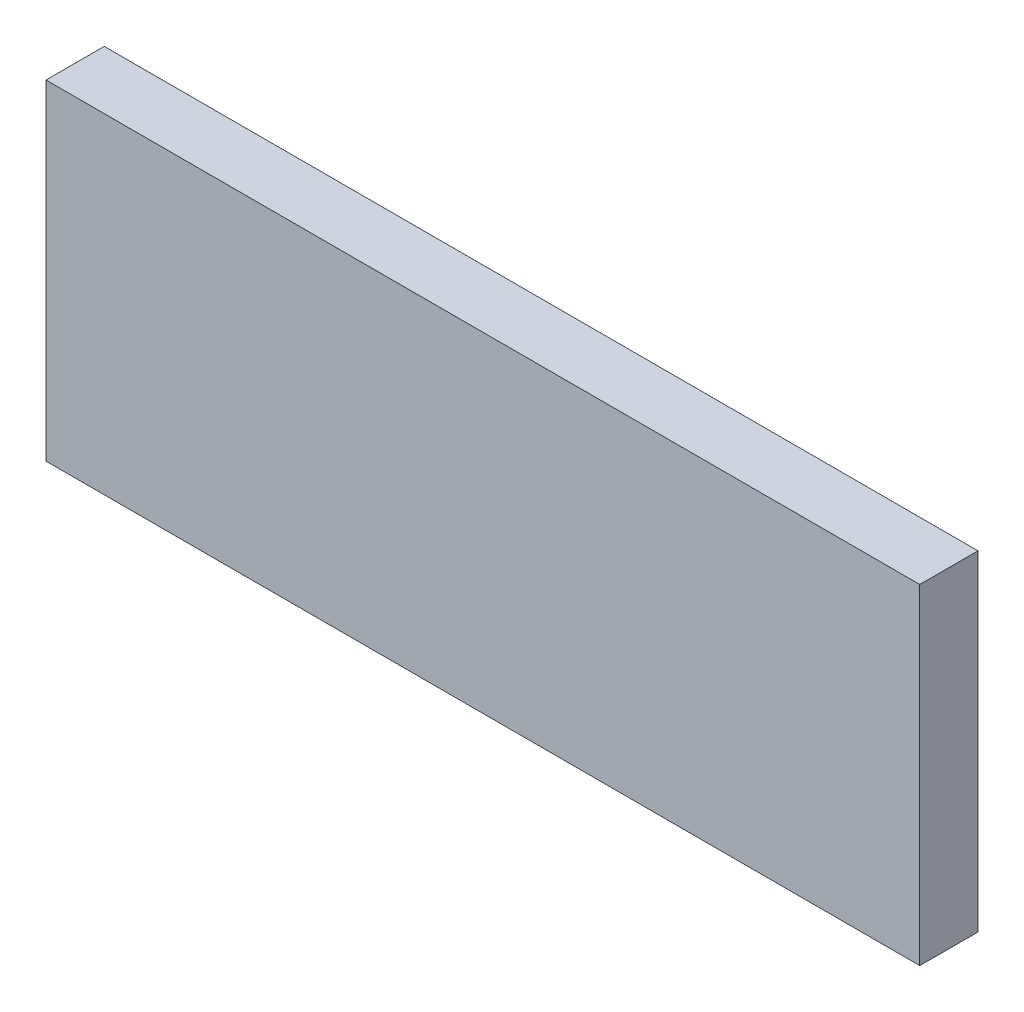
ISO-10303-21;
HEADER;
FILE_DESCRIPTION(('STEP AP214'),'2;1');
FILE_NAME('part.step','',(''),(''),'','','');
FILE_SCHEMA(('AUTOMOTIVE_DESIGN { 1 0 10303 214 1 1 1 1 }'));
ENDSEC;
DATA;
#1=APPLICATION_CONTEXT('core data for automotive mechanical design processes');
#2=APPLICATION_PROTOCOL_DEFINITION('international standard','automotive_design',2000,#1);
#3=PRODUCT_CONTEXT('',#1,'mechanical');
#4=PRODUCT('Part','Part','',(#3));
#5=PRODUCT_RELATED_PRODUCT_CATEGORY('part','',(#4));
#6=PRODUCT_DEFINITION_FORMATION('','',#4);
#7=PRODUCT_DEFINITION_CONTEXT('part definition',#1,'design');
#8=PRODUCT_DEFINITION('design','',#6,#7);
#9=PRODUCT_DEFINITION_SHAPE('','',#8);
#10=(LENGTH_UNIT() NAMED_UNIT(*) SI_UNIT(.MILLI.,.METRE.));
#11=(NAMED_UNIT(*) PLANE_ANGLE_UNIT() SI_UNIT($,.RADIAN.));
#12=(NAMED_UNIT(*) SI_UNIT($,.STERADIAN.) SOLID_ANGLE_UNIT());
#13=UNCERTAINTY_MEASURE_WITH_UNIT(LENGTH_MEASURE(1.E-05),#10,'distance_accuracy_value','');
#14=(GEOMETRIC_REPRESENTATION_CONTEXT(3) GLOBAL_UNCERTAINTY_ASSIGNED_CONTEXT((#13)) GLOBAL_UNIT_ASSIGNED_CONTEXT((#10,
#11,#12)) REPRESENTATION_CONTEXT('',''));
#15=CARTESIAN_POINT('',(0.,0.,0.));
#16=DIRECTION('',(0.,0.,1.));
#17=DIRECTION('',(1.,0.,0.));
#18=AXIS2_PLACEMENT_3D('',#15,#16,#17);
#19=CARTESIAN_POINT('',(0.,0.,300.));
#20=DIRECTION('',(1.,0.,0.));
#21=DIRECTION('',(0.,0.,-1.));
#22=AXIS2_PLACEMENT_3D('',#19,#20,#21);
#23=PLANE('',#22);
#24=DIRECTION('',(0.,-1.,0.));
#25=VECTOR('',#24,1.);
#26=CARTESIAN_POINT('',(0.,0.,0.));
#27=LINE('',#26,#25);
#28=CARTESIAN_POINT('',(0.,1700.,0.));
#29=VERTEX_POINT('',#28);
#30=CARTESIAN_POINT('',(0.,0.,0.));
#31=VERTEX_POINT('',#30);
#32=EDGE_CURVE('E155',#29,#31,#27,.T.);
#33=ORIENTED_EDGE('',*,*,#32,.T.);
#34=DIRECTION('',(0.,0.,-1.));
#35=VECTOR('',#34,1.);
#36=CARTESIAN_POINT('',(0.,0.,300.));
#37=LINE('',#36,#35);
#38=CARTESIAN_POINT('',(0.,0.,300.));
#39=VERTEX_POINT('',#38);
#40=EDGE_CURVE('E144',#39,#31,#37,.T.);
#41=ORIENTED_EDGE('',*,*,#40,.F.);
#42=DIRECTION('',(0.,-1.,0.));
#43=VECTOR('',#42,1.);
#44=CARTESIAN_POINT('',(0.,0.,300.));
#45=LINE('',#44,#43);
#46=CARTESIAN_POINT('',(0.,1700.,300.));
#47=VERTEX_POINT('',#46);
#48=EDGE_CURVE('E136',#47,#39,#45,.T.);
#49=ORIENTED_EDGE('',*,*,#48,.F.);
#50=DIRECTION('',(0.,0.,-1.));
#51=VECTOR('',#50,1.);
#52=CARTESIAN_POINT('',(0.,1700.,300.));
#53=LINE('',#52,#51);
#54=EDGE_CURVE('E151',#47,#29,#53,.T.);
#55=ORIENTED_EDGE('',*,*,#54,.T.);
#56=EDGE_LOOP('',(#33,#41,#49,#55));
#57=FACE_BOUND('',#56,.T.);
#58=ADVANCED_FACE('F42',(#57),#23,.F.);
#59=CARTESIAN_POINT('',(0.,0.,300.));
#60=DIRECTION('',(0.,1.,0.));
#61=DIRECTION('',(0.,0.,1.));
#62=AXIS2_PLACEMENT_3D('',#59,#60,#61);
#63=PLANE('',#62);
#64=DIRECTION('',(1.,0.,0.));
#65=VECTOR('',#64,1.);
#66=CARTESIAN_POINT('',(0.,0.,0.));
#67=LINE('',#66,#65);
#68=CARTESIAN_POINT('',(4500.,0.,0.));
#69=VERTEX_POINT('',#68);
#70=EDGE_CURVE('E142',#31,#69,#67,.T.);
#71=ORIENTED_EDGE('',*,*,#70,.T.);
#72=DIRECTION('',(0.,0.,-1.));
#73=VECTOR('',#72,1.);
#74=CARTESIAN_POINT('',(4500.,0.,300.));
#75=LINE('',#74,#73);
#76=CARTESIAN_POINT('',(4500.,0.,300.));
#77=VERTEX_POINT('',#76);
#78=EDGE_CURVE('E140',#77,#69,#75,.T.);
#79=ORIENTED_EDGE('',*,*,#78,.F.);
#80=DIRECTION('',(1.,0.,0.));
#81=VECTOR('',#80,1.);
#82=CARTESIAN_POINT('',(0.,0.,300.));
#83=LINE('',#82,#81);
#84=EDGE_CURVE('E131',#39,#77,#83,.T.);
#85=ORIENTED_EDGE('',*,*,#84,.F.);
#86=ORIENTED_EDGE('',*,*,#40,.T.);
#87=EDGE_LOOP('',(#71,#79,#85,#86));
#88=FACE_BOUND('',#87,.T.);
#89=ADVANCED_FACE('F141',(#88),#63,.F.);
#90=CARTESIAN_POINT('',(4500.,0.,300.));
#91=DIRECTION('',(-1.,0.,0.));
#92=DIRECTION('',(0.,0.,1.));
#93=AXIS2_PLACEMENT_3D('',#90,#91,#92);
#94=PLANE('',#93);
#95=DIRECTION('',(0.,1.,0.));
#96=VECTOR('',#95,1.);
#97=CARTESIAN_POINT('',(4500.,0.,0.));
#98=LINE('',#97,#96);
#99=CARTESIAN_POINT('',(4500.,1700.,0.));
#100=VERTEX_POINT('',#99);
#101=EDGE_CURVE('E115',#69,#100,#98,.T.);
#102=ORIENTED_EDGE('',*,*,#101,.T.);
#103=DIRECTION('',(0.,0.,-1.));
#104=VECTOR('',#103,1.);
#105=CARTESIAN_POINT('',(4500.,1700.,300.));
#106=LINE('',#105,#104);
#107=CARTESIAN_POINT('',(4500.,1700.,300.));
#108=VERTEX_POINT('',#107);
#109=EDGE_CURVE('E145',#108,#100,#106,.T.);
#110=ORIENTED_EDGE('',*,*,#109,.F.);
#111=DIRECTION('',(0.,1.,0.));
#112=VECTOR('',#111,1.);
#113=CARTESIAN_POINT('',(4500.,0.,300.));
#114=LINE('',#113,#112);
#115=EDGE_CURVE('E134',#77,#108,#114,.T.);
#116=ORIENTED_EDGE('',*,*,#115,.F.);
#117=ORIENTED_EDGE('',*,*,#78,.T.);
#118=EDGE_LOOP('',(#102,#110,#116,#117));
#119=FACE_BOUND('',#118,.T.);
#120=ADVANCED_FACE('F147',(#119),#94,.F.);
#121=CARTESIAN_POINT('',(0.,1700.,300.));
#122=DIRECTION('',(0.,-1.,0.));
#123=DIRECTION('',(0.,0.,-1.));
#124=AXIS2_PLACEMENT_3D('',#121,#122,#123);
#125=PLANE('',#124);
#126=DIRECTION('',(-1.,0.,0.));
#127=VECTOR('',#126,1.);
#128=CARTESIAN_POINT('',(0.,1700.,0.));
#129=LINE('',#128,#127);
#130=EDGE_CURVE('E121',#100,#29,#129,.T.);
#131=ORIENTED_EDGE('',*,*,#130,.T.);
#132=ORIENTED_EDGE('',*,*,#54,.F.);
#133=DIRECTION('',(-1.,0.,0.));
#134=VECTOR('',#133,1.);
#135=CARTESIAN_POINT('',(0.,1700.,300.));
#136=LINE('',#135,#134);
#137=EDGE_CURVE('E98',#108,#47,#136,.T.);
#138=ORIENTED_EDGE('',*,*,#137,.F.);
#139=ORIENTED_EDGE('',*,*,#109,.T.);
#140=EDGE_LOOP('',(#131,#132,#138,#139));
#141=FACE_BOUND('',#140,.T.);
#142=ADVANCED_FACE('F237',(#141),#125,.F.);
#143=CARTESIAN_POINT('',(0.,0.,300.));
#144=DIRECTION('',(0.,0.,-1.));
#145=DIRECTION('',(-1.,0.,0.));
#146=AXIS2_PLACEMENT_3D('',#143,#144,#145);
#147=PLANE('',#146);
#148=ORIENTED_EDGE('',*,*,#48,.T.);
#149=ORIENTED_EDGE('',*,*,#84,.T.);
#150=ORIENTED_EDGE('',*,*,#115,.T.);
#151=ORIENTED_EDGE('',*,*,#137,.T.);
#152=EDGE_LOOP('',(#148,#149,#150,#151));
#153=FACE_BOUND('',#152,.T.);
#154=ADVANCED_FACE('F132',(#153),#147,.F.);
#155=CARTESIAN_POINT('',(0.,0.,0.));
#156=DIRECTION('',(0.,0.,-1.));
#157=DIRECTION('',(-1.,0.,0.));
#158=AXIS2_PLACEMENT_3D('',#155,#156,#157);
#159=PLANE('',#158);
#160=ORIENTED_EDGE('',*,*,#32,.F.);
#161=ORIENTED_EDGE('',*,*,#130,.F.);
#162=ORIENTED_EDGE('',*,*,#101,.F.);
#163=ORIENTED_EDGE('',*,*,#70,.F.);
#164=EDGE_LOOP('',(#160,#161,#162,#163));
#165=FACE_BOUND('',#164,.T.);
#166=ADVANCED_FACE('F240',(#165),#159,.T.);
#167=CLOSED_SHELL('',(#58,#89,#120,#142,#154,#166));
#168=CARTESIAN_POINT('',(10.,0.,300.));
#169=DIRECTION('',(1.,0.,0.));
#170=DIRECTION('',(0.,0.,-1.));
#171=AXIS2_PLACEMENT_3D('',#168,#169,#170);
#172=PLANE('',#171);
#173=DIRECTION('',(0.,-1.,0.));
#174=VECTOR('',#173,1.);
#175=CARTESIAN_POINT('',(10.,0.,10.));
#176=LINE('',#175,#174);
#177=CARTESIAN_POINT('',(10.,1690.,10.));
#178=VERTEX_POINT('',#177);
#179=CARTESIAN_POINT('',(10.,10.,10.));
#180=VERTEX_POINT('',#179);
#181=EDGE_CURVE('E46',#178,#180,#176,.T.);
#182=ORIENTED_EDGE('',*,*,#181,.F.);
#183=DIRECTION('',(0.,0.,-1.));
#184=VECTOR('',#183,1.);
#185=CARTESIAN_POINT('',(10.,1690.,300.));
#186=LINE('',#185,#184);
#187=CARTESIAN_POINT('',(10.,1690.,290.));
#188=VERTEX_POINT('',#187);
#189=EDGE_CURVE('E195',#188,#178,#186,.T.);
#190=ORIENTED_EDGE('',*,*,#189,.F.);
#191=DIRECTION('',(0.,-1.,0.));
#192=VECTOR('',#191,1.);
#193=CARTESIAN_POINT('',(10.,0.,290.));
#194=LINE('',#193,#192);
#195=CARTESIAN_POINT('',(10.,10.,290.));
#196=VERTEX_POINT('',#195);
#197=EDGE_CURVE('E175',#188,#196,#194,.T.);
#198=ORIENTED_EDGE('',*,*,#197,.T.);
#199=DIRECTION('',(0.,0.,-1.));
#200=VECTOR('',#199,1.);
#201=CARTESIAN_POINT('',(10.,10.,300.));
#202=LINE('',#201,#200);
#203=EDGE_CURVE('E191',#196,#180,#202,.T.);
#204=ORIENTED_EDGE('',*,*,#203,.T.);
#205=EDGE_LOOP('',(#182,#190,#198,#204));
#206=FACE_BOUND('',#205,.T.);
#207=ADVANCED_FACE('F204',(#206),#172,.T.);
#208=CARTESIAN_POINT('',(0.,10.,300.));
#209=DIRECTION('',(0.,1.,0.));
#210=DIRECTION('',(0.,0.,1.));
#211=AXIS2_PLACEMENT_3D('',#208,#209,#210);
#212=PLANE('',#211);
#213=DIRECTION('',(1.,0.,0.));
#214=VECTOR('',#213,1.);
#215=CARTESIAN_POINT('',(0.,10.,10.));
#216=LINE('',#215,#214);
#217=CARTESIAN_POINT('',(4490.,10.,10.));
#218=VERTEX_POINT('',#217);
#219=EDGE_CURVE('E63',#180,#218,#216,.T.);
#220=ORIENTED_EDGE('',*,*,#219,.F.);
#221=ORIENTED_EDGE('',*,*,#203,.F.);
#222=DIRECTION('',(1.,0.,0.));
#223=VECTOR('',#222,1.);
#224=CARTESIAN_POINT('',(0.,10.,290.));
#225=LINE('',#224,#223);
#226=CARTESIAN_POINT('',(4490.,10.,290.));
#227=VERTEX_POINT('',#226);
#228=EDGE_CURVE('E86',#196,#227,#225,.T.);
#229=ORIENTED_EDGE('',*,*,#228,.T.);
#230=DIRECTION('',(0.,0.,-1.));
#231=VECTOR('',#230,1.);
#232=CARTESIAN_POINT('',(4490.,10.,300.));
#233=LINE('',#232,#231);
#234=EDGE_CURVE('E185',#227,#218,#233,.T.);
#235=ORIENTED_EDGE('',*,*,#234,.T.);
#236=EDGE_LOOP('',(#220,#221,#229,#235));
#237=FACE_BOUND('',#236,.T.);
#238=ADVANCED_FACE('F205',(#237),#212,.T.);
#239=CARTESIAN_POINT('',(4490.,0.,300.));
#240=DIRECTION('',(-1.,0.,0.));
#241=DIRECTION('',(0.,0.,1.));
#242=AXIS2_PLACEMENT_3D('',#239,#240,#241);
#243=PLANE('',#242);
#244=DIRECTION('',(0.,1.,0.));
#245=VECTOR('',#244,1.);
#246=CARTESIAN_POINT('',(4490.,0.,10.));
#247=LINE('',#246,#245);
#248=CARTESIAN_POINT('',(4490.,1690.,10.));
#249=VERTEX_POINT('',#248);
#250=EDGE_CURVE('E188',#218,#249,#247,.T.);
#251=ORIENTED_EDGE('',*,*,#250,.F.);
#252=ORIENTED_EDGE('',*,*,#234,.F.);
#253=DIRECTION('',(0.,1.,0.));
#254=VECTOR('',#253,1.);
#255=CARTESIAN_POINT('',(4490.,0.,290.));
#256=LINE('',#255,#254);
#257=CARTESIAN_POINT('',(4490.,1690.,290.));
#258=VERTEX_POINT('',#257);
#259=EDGE_CURVE('E54',#227,#258,#256,.T.);
#260=ORIENTED_EDGE('',*,*,#259,.T.);
#261=DIRECTION('',(0.,0.,-1.));
#262=VECTOR('',#261,1.);
#263=CARTESIAN_POINT('',(4490.,1690.,300.));
#264=LINE('',#263,#262);
#265=EDGE_CURVE('E178',#258,#249,#264,.T.);
#266=ORIENTED_EDGE('',*,*,#265,.T.);
#267=EDGE_LOOP('',(#251,#252,#260,#266));
#268=FACE_BOUND('',#267,.T.);
#269=ADVANCED_FACE('F209',(#268),#243,.T.);
#270=CARTESIAN_POINT('',(0.,1690.,300.));
#271=DIRECTION('',(0.,-1.,0.));
#272=DIRECTION('',(0.,0.,-1.));
#273=AXIS2_PLACEMENT_3D('',#270,#271,#272);
#274=PLANE('',#273);
#275=DIRECTION('',(-1.,0.,0.));
#276=VECTOR('',#275,1.);
#277=CARTESIAN_POINT('',(0.,1690.,10.));
#278=LINE('',#277,#276);
#279=EDGE_CURVE('E182',#249,#178,#278,.T.);
#280=ORIENTED_EDGE('',*,*,#279,.F.);
#281=ORIENTED_EDGE('',*,*,#265,.F.);
#282=DIRECTION('',(-1.,0.,0.));
#283=VECTOR('',#282,1.);
#284=CARTESIAN_POINT('',(0.,1690.,290.));
#285=LINE('',#284,#283);
#286=EDGE_CURVE('E11',#258,#188,#285,.T.);
#287=ORIENTED_EDGE('',*,*,#286,.T.);
#288=ORIENTED_EDGE('',*,*,#189,.T.);
#289=EDGE_LOOP('',(#280,#281,#287,#288));
#290=FACE_BOUND('',#289,.T.);
#291=ADVANCED_FACE('F213',(#290),#274,.T.);
#292=CARTESIAN_POINT('',(0.,0.,290.));
#293=DIRECTION('',(0.,0.,-1.));
#294=DIRECTION('',(-1.,0.,0.));
#295=AXIS2_PLACEMENT_3D('',#292,#293,#294);
#296=PLANE('',#295);
#297=ORIENTED_EDGE('',*,*,#197,.F.);
#298=ORIENTED_EDGE('',*,*,#286,.F.);
#299=ORIENTED_EDGE('',*,*,#259,.F.);
#300=ORIENTED_EDGE('',*,*,#228,.F.);
#301=EDGE_LOOP('',(#297,#298,#299,#300));
#302=FACE_BOUND('',#301,.T.);
#303=ADVANCED_FACE('F212',(#302),#296,.T.);
#304=CARTESIAN_POINT('',(0.,0.,10.));
#305=DIRECTION('',(0.,0.,-1.));
#306=DIRECTION('',(-1.,0.,0.));
#307=AXIS2_PLACEMENT_3D('',#304,#305,#306);
#308=PLANE('',#307);
#309=ORIENTED_EDGE('',*,*,#181,.T.);
#310=ORIENTED_EDGE('',*,*,#219,.T.);
#311=ORIENTED_EDGE('',*,*,#250,.T.);
#312=ORIENTED_EDGE('',*,*,#279,.T.);
#313=EDGE_LOOP('',(#309,#310,#311,#312));
#314=FACE_BOUND('',#313,.T.);
#315=ADVANCED_FACE('F44',(#314),#308,.F.);
#316=CLOSED_SHELL('',(#207,#238,#269,#291,#303,#315));
#317=ORIENTED_CLOSED_SHELL('',*,#316,.T.);
#318=BREP_WITH_VOIDS('B2',#167,(#317));
#319=ADVANCED_BREP_SHAPE_REPRESENTATION('',(#18,#318),#14);
#320=SHAPE_DEFINITION_REPRESENTATION(#9,#319);
ENDSEC;
END-ISO-10303-21;
